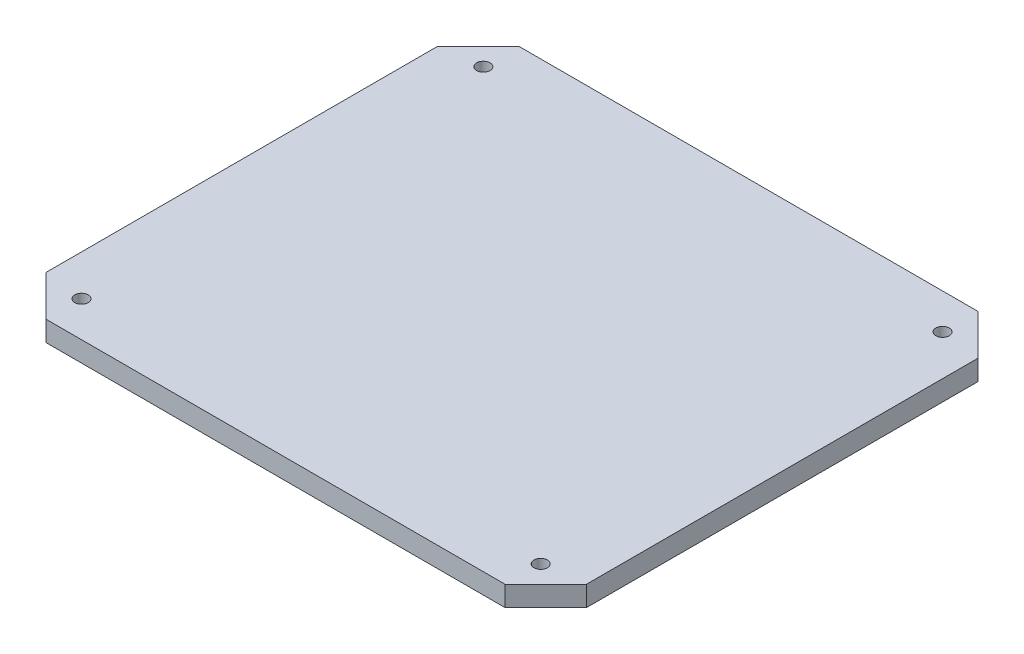
ISO-10303-21;
HEADER;
FILE_DESCRIPTION(('STEP AP214'),'2;1');
FILE_NAME('part.step','',(''),(''),'','','');
FILE_SCHEMA(('AUTOMOTIVE_DESIGN { 1 0 10303 214 1 1 1 1 }'));
ENDSEC;
DATA;
#1=APPLICATION_CONTEXT('core data for automotive mechanical design processes');
#2=APPLICATION_PROTOCOL_DEFINITION('international standard','automotive_design',2000,#1);
#3=PRODUCT_CONTEXT('',#1,'mechanical');
#4=PRODUCT('Part','Part','',(#3));
#5=PRODUCT_RELATED_PRODUCT_CATEGORY('part','',(#4));
#6=PRODUCT_DEFINITION_FORMATION('','',#4);
#7=PRODUCT_DEFINITION_CONTEXT('part definition',#1,'design');
#8=PRODUCT_DEFINITION('design','',#6,#7);
#9=PRODUCT_DEFINITION_SHAPE('','',#8);
#10=(LENGTH_UNIT() NAMED_UNIT(*) SI_UNIT(.MILLI.,.METRE.));
#11=(NAMED_UNIT(*) PLANE_ANGLE_UNIT() SI_UNIT($,.RADIAN.));
#12=(NAMED_UNIT(*) SI_UNIT($,.STERADIAN.) SOLID_ANGLE_UNIT());
#13=UNCERTAINTY_MEASURE_WITH_UNIT(LENGTH_MEASURE(1.E-05),#10,'distance_accuracy_value','');
#14=(GEOMETRIC_REPRESENTATION_CONTEXT(3) GLOBAL_UNCERTAINTY_ASSIGNED_CONTEXT((#13)) GLOBAL_UNIT_ASSIGNED_CONTEXT((#10,
#11,#12)) REPRESENTATION_CONTEXT('',''));
#15=CARTESIAN_POINT('',(0.,0.,0.));
#16=DIRECTION('',(0.,0.,1.));
#17=DIRECTION('',(1.,0.,0.));
#18=AXIS2_PLACEMENT_3D('',#15,#16,#17);
#19=CARTESIAN_POINT('',(0.,15.,0.));
#20=DIRECTION('',(0.,-1.,0.));
#21=DIRECTION('',(0.,0.,-1.));
#22=AXIS2_PLACEMENT_3D('',#19,#20,#21);
#23=PLANE('',#22);
#24=DIRECTION('',(0.,0.,1.));
#25=VECTOR('',#24,1.);
#26=CARTESIAN_POINT('',(-200.,15.,175.));
#27=LINE('',#26,#25);
#28=CARTESIAN_POINT('',(-200.,15.,-145.));
#29=VERTEX_POINT('',#28);
#30=CARTESIAN_POINT('',(-200.,15.,145.));
#31=VERTEX_POINT('',#30);
#32=EDGE_CURVE('E41',#29,#31,#27,.T.);
#33=ORIENTED_EDGE('',*,*,#32,.T.);
#34=DIRECTION('',(-0.707106781186547,0.,-0.707106781186547));
#35=VECTOR('',#34,1.);
#36=CARTESIAN_POINT('',(-170.,15.,175.));
#37=LINE('',#36,#35);
#38=CARTESIAN_POINT('',(-170.,15.,175.));
#39=VERTEX_POINT('',#38);
#40=EDGE_CURVE('E151',#39,#31,#37,.T.);
#41=ORIENTED_EDGE('',*,*,#40,.F.);
#42=DIRECTION('',(1.,0.,0.));
#43=VECTOR('',#42,1.);
#44=CARTESIAN_POINT('',(-200.,15.,175.));
#45=LINE('',#44,#43);
#46=CARTESIAN_POINT('',(170.,15.,175.));
#47=VERTEX_POINT('',#46);
#48=EDGE_CURVE('E11',#39,#47,#45,.T.);
#49=ORIENTED_EDGE('',*,*,#48,.T.);
#50=DIRECTION('',(-0.707106781186547,0.,0.707106781186547));
#51=VECTOR('',#50,1.);
#52=CARTESIAN_POINT('',(170.,15.,175.));
#53=LINE('',#52,#51);
#54=CARTESIAN_POINT('',(200.,15.,145.));
#55=VERTEX_POINT('',#54);
#56=EDGE_CURVE('E157',#55,#47,#53,.T.);
#57=ORIENTED_EDGE('',*,*,#56,.F.);
#58=DIRECTION('',(0.,0.,-1.));
#59=VECTOR('',#58,1.);
#60=CARTESIAN_POINT('',(200.,15.,175.));
#61=LINE('',#60,#59);
#62=CARTESIAN_POINT('',(200.,15.,-145.));
#63=VERTEX_POINT('',#62);
#64=EDGE_CURVE('E134',#55,#63,#61,.T.);
#65=ORIENTED_EDGE('',*,*,#64,.T.);
#66=DIRECTION('',(0.707106781186547,0.,0.707106781186547));
#67=VECTOR('',#66,1.);
#68=CARTESIAN_POINT('',(170.,15.,-175.));
#69=LINE('',#68,#67);
#70=CARTESIAN_POINT('',(170.,15.,-175.));
#71=VERTEX_POINT('',#70);
#72=EDGE_CURVE('E100',#71,#63,#69,.T.);
#73=ORIENTED_EDGE('',*,*,#72,.F.);
#74=DIRECTION('',(-1.,0.,0.));
#75=VECTOR('',#74,1.);
#76=CARTESIAN_POINT('',(-200.,15.,-175.));
#77=LINE('',#76,#75);
#78=CARTESIAN_POINT('',(-170.,15.,-175.));
#79=VERTEX_POINT('',#78);
#80=EDGE_CURVE('E139',#71,#79,#77,.T.);
#81=ORIENTED_EDGE('',*,*,#80,.T.);
#82=DIRECTION('',(0.707106781186547,0.,-0.707106781186547));
#83=VECTOR('',#82,1.);
#84=CARTESIAN_POINT('',(-170.,15.,-175.));
#85=LINE('',#84,#83);
#86=EDGE_CURVE('E105',#29,#79,#85,.T.);
#87=ORIENTED_EDGE('',*,*,#86,.F.);
#88=EDGE_LOOP('',(#33,#41,#49,#57,#65,#73,#81,#87));
#89=FACE_BOUND('',#88,.T.);
#90=CARTESIAN_POINT('',(-170.,15.,-148.75));
#91=DIRECTION('',(0.,1.,0.));
#92=DIRECTION('',(0.,0.,1.));
#93=AXIS2_PLACEMENT_3D('',#90,#91,#92);
#94=CIRCLE('',#93,4.99999999999999);
#95=CARTESIAN_POINT('',(-170.,15.,-143.75));
#96=VERTEX_POINT('',#95);
#97=EDGE_CURVE('E121',#96,#96,#94,.T.);
#98=ORIENTED_EDGE('',*,*,#97,.F.);
#99=EDGE_LOOP('',(#98));
#100=FACE_BOUND('',#99,.T.);
#101=CARTESIAN_POINT('',(170.,15.,-148.75));
#102=DIRECTION('',(0.,1.,0.));
#103=DIRECTION('',(0.,0.,-1.));
#104=AXIS2_PLACEMENT_3D('',#101,#102,#103);
#105=CIRCLE('',#104,4.99999999999999);
#106=CARTESIAN_POINT('',(170.,15.,-153.75));
#107=VERTEX_POINT('',#106);
#108=EDGE_CURVE('E186',#107,#107,#105,.T.);
#109=ORIENTED_EDGE('',*,*,#108,.F.);
#110=EDGE_LOOP('',(#109));
#111=FACE_BOUND('',#110,.T.);
#112=CARTESIAN_POINT('',(170.,15.,148.75));
#113=DIRECTION('',(0.,1.,0.));
#114=DIRECTION('',(0.,0.,1.));
#115=AXIS2_PLACEMENT_3D('',#112,#113,#114);
#116=CIRCLE('',#115,4.99999999999999);
#117=CARTESIAN_POINT('',(170.,15.,153.75));
#118=VERTEX_POINT('',#117);
#119=EDGE_CURVE('E180',#118,#118,#116,.T.);
#120=ORIENTED_EDGE('',*,*,#119,.F.);
#121=EDGE_LOOP('',(#120));
#122=FACE_BOUND('',#121,.T.);
#123=CARTESIAN_POINT('',(-170.,15.,148.75));
#124=DIRECTION('',(0.,1.,0.));
#125=DIRECTION('',(0.,0.,-1.));
#126=AXIS2_PLACEMENT_3D('',#123,#124,#125);
#127=CIRCLE('',#126,4.99999999999999);
#128=CARTESIAN_POINT('',(-170.,15.,143.75));
#129=VERTEX_POINT('',#128);
#130=EDGE_CURVE('E174',#129,#129,#127,.T.);
#131=ORIENTED_EDGE('',*,*,#130,.F.);
#132=EDGE_LOOP('',(#131));
#133=FACE_BOUND('',#132,.T.);
#134=ADVANCED_FACE('F32',(#89,#100,#111,#122,#133),#23,.F.);
#135=CARTESIAN_POINT('',(0.,0.,0.));
#136=DIRECTION('',(0.,-1.,0.));
#137=DIRECTION('',(0.,0.,-1.));
#138=AXIS2_PLACEMENT_3D('',#135,#136,#137);
#139=PLANE('',#138);
#140=DIRECTION('',(-0.707106781186547,0.,-0.707106781186547));
#141=VECTOR('',#140,1.);
#142=CARTESIAN_POINT('',(-170.,0.,175.));
#143=LINE('',#142,#141);
#144=CARTESIAN_POINT('',(-170.,0.,175.));
#145=VERTEX_POINT('',#144);
#146=CARTESIAN_POINT('',(-200.,0.,145.));
#147=VERTEX_POINT('',#146);
#148=EDGE_CURVE('E162',#145,#147,#143,.T.);
#149=ORIENTED_EDGE('',*,*,#148,.T.);
#150=DIRECTION('',(0.,0.,1.));
#151=VECTOR('',#150,1.);
#152=CARTESIAN_POINT('',(-200.,0.,175.));
#153=LINE('',#152,#151);
#154=CARTESIAN_POINT('',(-200.,0.,-145.));
#155=VERTEX_POINT('',#154);
#156=EDGE_CURVE('E123',#155,#147,#153,.T.);
#157=ORIENTED_EDGE('',*,*,#156,.F.);
#158=DIRECTION('',(0.707106781186547,0.,-0.707106781186547));
#159=VECTOR('',#158,1.);
#160=CARTESIAN_POINT('',(-170.,0.,-175.));
#161=LINE('',#160,#159);
#162=CARTESIAN_POINT('',(-170.,0.,-175.));
#163=VERTEX_POINT('',#162);
#164=EDGE_CURVE('E57',#155,#163,#161,.T.);
#165=ORIENTED_EDGE('',*,*,#164,.T.);
#166=DIRECTION('',(-1.,0.,0.));
#167=VECTOR('',#166,1.);
#168=CARTESIAN_POINT('',(-200.,0.,-175.));
#169=LINE('',#168,#167);
#170=CARTESIAN_POINT('',(170.,0.,-175.));
#171=VERTEX_POINT('',#170);
#172=EDGE_CURVE('E117',#171,#163,#169,.T.);
#173=ORIENTED_EDGE('',*,*,#172,.F.);
#174=DIRECTION('',(0.707106781186547,0.,0.707106781186547));
#175=VECTOR('',#174,1.);
#176=CARTESIAN_POINT('',(170.,0.,-175.));
#177=LINE('',#176,#175);
#178=CARTESIAN_POINT('',(200.,0.,-145.));
#179=VERTEX_POINT('',#178);
#180=EDGE_CURVE('E49',#171,#179,#177,.T.);
#181=ORIENTED_EDGE('',*,*,#180,.T.);
#182=DIRECTION('',(0.,0.,-1.));
#183=VECTOR('',#182,1.);
#184=CARTESIAN_POINT('',(200.,0.,175.));
#185=LINE('',#184,#183);
#186=CARTESIAN_POINT('',(200.,0.,145.));
#187=VERTEX_POINT('',#186);
#188=EDGE_CURVE('E115',#187,#179,#185,.T.);
#189=ORIENTED_EDGE('',*,*,#188,.F.);
#190=DIRECTION('',(-0.707106781186547,0.,0.707106781186547));
#191=VECTOR('',#190,1.);
#192=CARTESIAN_POINT('',(170.,0.,175.));
#193=LINE('',#192,#191);
#194=CARTESIAN_POINT('',(170.,0.,175.));
#195=VERTEX_POINT('',#194);
#196=EDGE_CURVE('E160',#187,#195,#193,.T.);
#197=ORIENTED_EDGE('',*,*,#196,.T.);
#198=DIRECTION('',(1.,0.,0.));
#199=VECTOR('',#198,1.);
#200=CARTESIAN_POINT('',(-200.,0.,175.));
#201=LINE('',#200,#199);
#202=EDGE_CURVE('E36',#145,#195,#201,.T.);
#203=ORIENTED_EDGE('',*,*,#202,.F.);
#204=EDGE_LOOP('',(#149,#157,#165,#173,#181,#189,#197,#203));
#205=FACE_BOUND('',#204,.T.);
#206=CARTESIAN_POINT('',(170.,0.,148.75));
#207=DIRECTION('',(0.,1.,0.));
#208=DIRECTION('',(0.,0.,1.));
#209=AXIS2_PLACEMENT_3D('',#206,#207,#208);
#210=CIRCLE('',#209,4.99999999999999);
#211=CARTESIAN_POINT('',(170.,0.,153.75));
#212=VERTEX_POINT('',#211);
#213=EDGE_CURVE('E177',#212,#212,#210,.T.);
#214=ORIENTED_EDGE('',*,*,#213,.T.);
#215=EDGE_LOOP('',(#214));
#216=FACE_BOUND('',#215,.T.);
#217=CARTESIAN_POINT('',(-170.,0.,-148.75));
#218=DIRECTION('',(0.,1.,0.));
#219=DIRECTION('',(0.,0.,1.));
#220=AXIS2_PLACEMENT_3D('',#217,#218,#219);
#221=CIRCLE('',#220,4.99999999999999);
#222=CARTESIAN_POINT('',(-170.,0.,-143.75));
#223=VERTEX_POINT('',#222);
#224=EDGE_CURVE('E126',#223,#223,#221,.T.);
#225=ORIENTED_EDGE('',*,*,#224,.T.);
#226=EDGE_LOOP('',(#225));
#227=FACE_BOUND('',#226,.T.);
#228=CARTESIAN_POINT('',(170.,0.,-148.75));
#229=DIRECTION('',(0.,1.,0.));
#230=DIRECTION('',(0.,0.,-1.));
#231=AXIS2_PLACEMENT_3D('',#228,#229,#230);
#232=CIRCLE('',#231,4.99999999999999);
#233=CARTESIAN_POINT('',(170.,0.,-153.75));
#234=VERTEX_POINT('',#233);
#235=EDGE_CURVE('E183',#234,#234,#232,.T.);
#236=ORIENTED_EDGE('',*,*,#235,.T.);
#237=EDGE_LOOP('',(#236));
#238=FACE_BOUND('',#237,.T.);
#239=CARTESIAN_POINT('',(-170.,0.,148.75));
#240=DIRECTION('',(0.,1.,0.));
#241=DIRECTION('',(0.,0.,-1.));
#242=AXIS2_PLACEMENT_3D('',#239,#240,#241);
#243=CIRCLE('',#242,4.99999999999999);
#244=CARTESIAN_POINT('',(-170.,0.,143.75));
#245=VERTEX_POINT('',#244);
#246=EDGE_CURVE('E172',#245,#245,#243,.T.);
#247=ORIENTED_EDGE('',*,*,#246,.T.);
#248=EDGE_LOOP('',(#247));
#249=FACE_BOUND('',#248,.T.);
#250=ADVANCED_FACE('F112',(#205,#216,#227,#238,#249),#139,.T.);
#251=CARTESIAN_POINT('',(200.,15.,175.));
#252=DIRECTION('',(-1.,0.,0.));
#253=DIRECTION('',(0.,0.,1.));
#254=AXIS2_PLACEMENT_3D('',#251,#252,#253);
#255=PLANE('',#254);
#256=ORIENTED_EDGE('',*,*,#64,.F.);
#257=DIRECTION('',(0.,1.,0.));
#258=VECTOR('',#257,1.);
#259=CARTESIAN_POINT('',(200.,0.,145.));
#260=LINE('',#259,#258);
#261=EDGE_CURVE('E120',#187,#55,#260,.T.);
#262=ORIENTED_EDGE('',*,*,#261,.F.);
#263=ORIENTED_EDGE('',*,*,#188,.T.);
#264=DIRECTION('',(0.,1.,0.));
#265=VECTOR('',#264,1.);
#266=CARTESIAN_POINT('',(200.,0.,-145.));
#267=LINE('',#266,#265);
#268=EDGE_CURVE('E97',#179,#63,#267,.T.);
#269=ORIENTED_EDGE('',*,*,#268,.T.);
#270=EDGE_LOOP('',(#256,#262,#263,#269));
#271=FACE_BOUND('',#270,.T.);
#272=ADVANCED_FACE('F34',(#271),#255,.F.);
#273=CARTESIAN_POINT('',(-200.,15.,-175.));
#274=DIRECTION('',(0.,0.,1.));
#275=DIRECTION('',(1.,0.,0.));
#276=AXIS2_PLACEMENT_3D('',#273,#274,#275);
#277=PLANE('',#276);
#278=ORIENTED_EDGE('',*,*,#80,.F.);
#279=DIRECTION('',(0.,1.,0.));
#280=VECTOR('',#279,1.);
#281=CARTESIAN_POINT('',(170.,0.,-175.));
#282=LINE('',#281,#280);
#283=EDGE_CURVE('E106',#171,#71,#282,.T.);
#284=ORIENTED_EDGE('',*,*,#283,.F.);
#285=ORIENTED_EDGE('',*,*,#172,.T.);
#286=DIRECTION('',(0.,1.,0.));
#287=VECTOR('',#286,1.);
#288=CARTESIAN_POINT('',(-170.,0.,-175.));
#289=LINE('',#288,#287);
#290=EDGE_CURVE('E169',#163,#79,#289,.T.);
#291=ORIENTED_EDGE('',*,*,#290,.T.);
#292=EDGE_LOOP('',(#278,#284,#285,#291));
#293=FACE_BOUND('',#292,.T.);
#294=ADVANCED_FACE('F220',(#293),#277,.F.);
#295=CARTESIAN_POINT('',(-200.,15.,175.));
#296=DIRECTION('',(1.,0.,0.));
#297=DIRECTION('',(0.,0.,-1.));
#298=AXIS2_PLACEMENT_3D('',#295,#296,#297);
#299=PLANE('',#298);
#300=ORIENTED_EDGE('',*,*,#156,.T.);
#301=DIRECTION('',(0.,1.,0.));
#302=VECTOR('',#301,1.);
#303=CARTESIAN_POINT('',(-200.,0.,145.));
#304=LINE('',#303,#302);
#305=EDGE_CURVE('E155',#147,#31,#304,.T.);
#306=ORIENTED_EDGE('',*,*,#305,.T.);
#307=ORIENTED_EDGE('',*,*,#32,.F.);
#308=DIRECTION('',(0.,1.,0.));
#309=VECTOR('',#308,1.);
#310=CARTESIAN_POINT('',(-200.,0.,-145.));
#311=LINE('',#310,#309);
#312=EDGE_CURVE('E154',#155,#29,#311,.T.);
#313=ORIENTED_EDGE('',*,*,#312,.F.);
#314=EDGE_LOOP('',(#300,#306,#307,#313));
#315=FACE_BOUND('',#314,.T.);
#316=ADVANCED_FACE('F153',(#315),#299,.F.);
#317=CARTESIAN_POINT('',(-200.,15.,175.));
#318=DIRECTION('',(0.,0.,-1.));
#319=DIRECTION('',(-1.,0.,0.));
#320=AXIS2_PLACEMENT_3D('',#317,#318,#319);
#321=PLANE('',#320);
#322=ORIENTED_EDGE('',*,*,#48,.F.);
#323=DIRECTION('',(0.,1.,0.));
#324=VECTOR('',#323,1.);
#325=CARTESIAN_POINT('',(-170.,0.,175.));
#326=LINE('',#325,#324);
#327=EDGE_CURVE('E158',#145,#39,#326,.T.);
#328=ORIENTED_EDGE('',*,*,#327,.F.);
#329=ORIENTED_EDGE('',*,*,#202,.T.);
#330=DIRECTION('',(0.,1.,0.));
#331=VECTOR('',#330,1.);
#332=CARTESIAN_POINT('',(170.,0.,175.));
#333=LINE('',#332,#331);
#334=EDGE_CURVE('E227',#195,#47,#333,.T.);
#335=ORIENTED_EDGE('',*,*,#334,.T.);
#336=EDGE_LOOP('',(#322,#328,#329,#335));
#337=FACE_BOUND('',#336,.T.);
#338=ADVANCED_FACE('F207',(#337),#321,.F.);
#339=CARTESIAN_POINT('',(-170.,15.,-148.75));
#340=DIRECTION('',(0.,-1.,0.));
#341=DIRECTION('',(0.,0.,-1.));
#342=AXIS2_PLACEMENT_3D('',#339,#340,#341);
#343=CYLINDRICAL_SURFACE('',#342,4.99999999999999);
#344=ORIENTED_EDGE('',*,*,#97,.T.);
#345=EDGE_LOOP('',(#344));
#346=FACE_BOUND('',#345,.T.);
#347=ORIENTED_EDGE('',*,*,#224,.F.);
#348=EDGE_LOOP('',(#347));
#349=FACE_BOUND('',#348,.T.);
#350=ADVANCED_FACE('F197',(#346,#349),#343,.F.);
#351=CARTESIAN_POINT('',(170.,15.,-148.75));
#352=DIRECTION('',(0.,-1.,0.));
#353=DIRECTION('',(0.,0.,-1.));
#354=AXIS2_PLACEMENT_3D('',#351,#352,#353);
#355=CYLINDRICAL_SURFACE('',#354,4.99999999999999);
#356=ORIENTED_EDGE('',*,*,#108,.T.);
#357=EDGE_LOOP('',(#356));
#358=FACE_BOUND('',#357,.T.);
#359=ORIENTED_EDGE('',*,*,#235,.F.);
#360=EDGE_LOOP('',(#359));
#361=FACE_BOUND('',#360,.T.);
#362=ADVANCED_FACE('F194',(#358,#361),#355,.F.);
#363=CARTESIAN_POINT('',(170.,15.,148.75));
#364=DIRECTION('',(0.,-1.,0.));
#365=DIRECTION('',(0.,0.,-1.));
#366=AXIS2_PLACEMENT_3D('',#363,#364,#365);
#367=CYLINDRICAL_SURFACE('',#366,4.99999999999999);
#368=ORIENTED_EDGE('',*,*,#119,.T.);
#369=EDGE_LOOP('',(#368));
#370=FACE_BOUND('',#369,.T.);
#371=ORIENTED_EDGE('',*,*,#213,.F.);
#372=EDGE_LOOP('',(#371));
#373=FACE_BOUND('',#372,.T.);
#374=ADVANCED_FACE('F196',(#370,#373),#367,.F.);
#375=CARTESIAN_POINT('',(-170.,15.,148.75));
#376=DIRECTION('',(0.,-1.,0.));
#377=DIRECTION('',(0.,0.,-1.));
#378=AXIS2_PLACEMENT_3D('',#375,#376,#377);
#379=CYLINDRICAL_SURFACE('',#378,4.99999999999999);
#380=ORIENTED_EDGE('',*,*,#130,.T.);
#381=EDGE_LOOP('',(#380));
#382=FACE_BOUND('',#381,.T.);
#383=ORIENTED_EDGE('',*,*,#246,.F.);
#384=EDGE_LOOP('',(#383));
#385=FACE_BOUND('',#384,.T.);
#386=ADVANCED_FACE('F204',(#382,#385),#379,.F.);
#387=CARTESIAN_POINT('',(170.,0.,175.));
#388=DIRECTION('',(-0.707106781186547,0.,-0.707106781186547));
#389=DIRECTION('',(-0.707106781186548,0.,0.707106781186548));
#390=AXIS2_PLACEMENT_3D('',#387,#388,#389);
#391=PLANE('',#390);
#392=ORIENTED_EDGE('',*,*,#56,.T.);
#393=ORIENTED_EDGE('',*,*,#334,.F.);
#394=ORIENTED_EDGE('',*,*,#196,.F.);
#395=ORIENTED_EDGE('',*,*,#261,.T.);
#396=EDGE_LOOP('',(#392,#393,#394,#395));
#397=FACE_BOUND('',#396,.T.);
#398=ADVANCED_FACE('F235',(#397),#391,.F.);
#399=CARTESIAN_POINT('',(-170.,0.,175.));
#400=DIRECTION('',(0.707106781186547,0.,-0.707106781186547));
#401=DIRECTION('',(-0.707106781186548,0.,-0.707106781186548));
#402=AXIS2_PLACEMENT_3D('',#399,#400,#401);
#403=PLANE('',#402);
#404=ORIENTED_EDGE('',*,*,#40,.T.);
#405=ORIENTED_EDGE('',*,*,#305,.F.);
#406=ORIENTED_EDGE('',*,*,#148,.F.);
#407=ORIENTED_EDGE('',*,*,#327,.T.);
#408=EDGE_LOOP('',(#404,#405,#406,#407));
#409=FACE_BOUND('',#408,.T.);
#410=ADVANCED_FACE('F233',(#409),#403,.F.);
#411=CARTESIAN_POINT('',(-170.,0.,-175.));
#412=DIRECTION('',(0.707106781186547,0.,0.707106781186547));
#413=DIRECTION('',(0.707106781186548,0.,-0.707106781186548));
#414=AXIS2_PLACEMENT_3D('',#411,#412,#413);
#415=PLANE('',#414);
#416=ORIENTED_EDGE('',*,*,#86,.T.);
#417=ORIENTED_EDGE('',*,*,#290,.F.);
#418=ORIENTED_EDGE('',*,*,#164,.F.);
#419=ORIENTED_EDGE('',*,*,#312,.T.);
#420=EDGE_LOOP('',(#416,#417,#418,#419));
#421=FACE_BOUND('',#420,.T.);
#422=ADVANCED_FACE('F242',(#421),#415,.F.);
#423=CARTESIAN_POINT('',(170.,0.,-175.));
#424=DIRECTION('',(-0.707106781186547,0.,0.707106781186547));
#425=DIRECTION('',(0.707106781186548,0.,0.707106781186548));
#426=AXIS2_PLACEMENT_3D('',#423,#424,#425);
#427=PLANE('',#426);
#428=ORIENTED_EDGE('',*,*,#72,.T.);
#429=ORIENTED_EDGE('',*,*,#268,.F.);
#430=ORIENTED_EDGE('',*,*,#180,.F.);
#431=ORIENTED_EDGE('',*,*,#283,.T.);
#432=EDGE_LOOP('',(#428,#429,#430,#431));
#433=FACE_BOUND('',#432,.T.);
#434=ADVANCED_FACE('F98',(#433),#427,.F.);
#435=CLOSED_SHELL('',(#134,#250,#272,#294,#316,#338,#350,#362,#374,#386,#398,#410,#422,#434));
#436=MANIFOLD_SOLID_BREP('B2',#435);
#437=ADVANCED_BREP_SHAPE_REPRESENTATION('',(#18,#436),#14);
#438=SHAPE_DEFINITION_REPRESENTATION(#9,#437);
ENDSEC;
END-ISO-10303-21;
